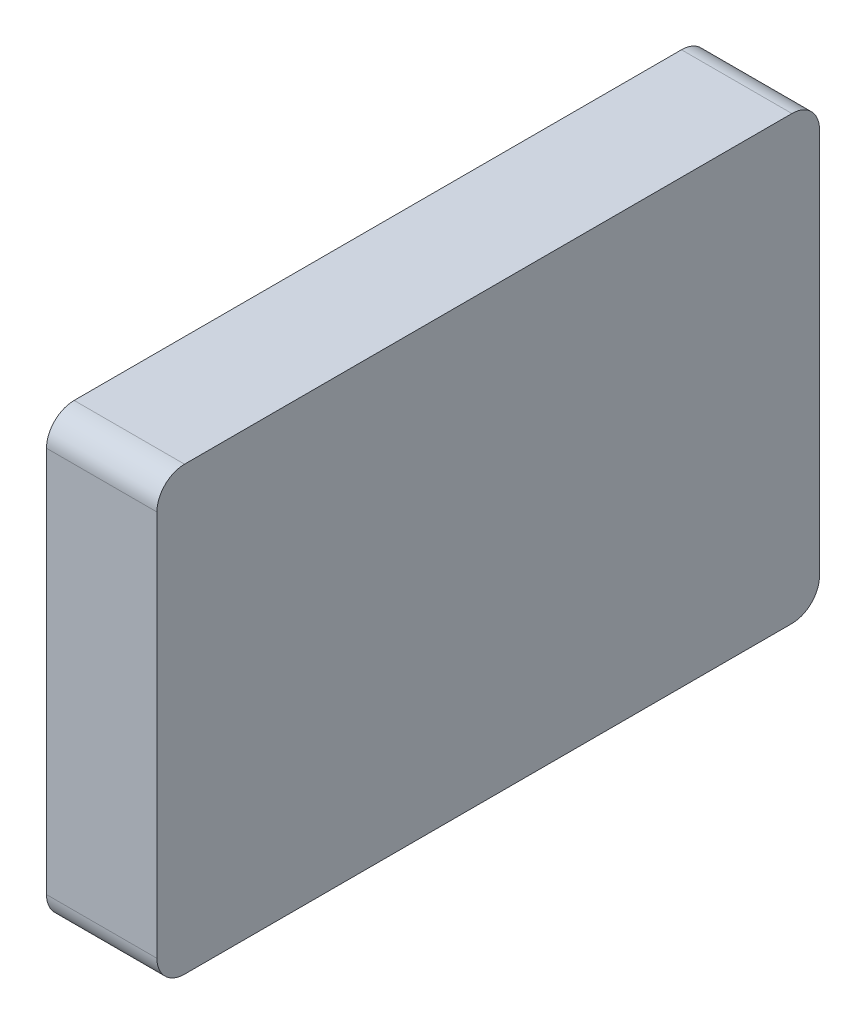
ISO-10303-21;
HEADER;
FILE_DESCRIPTION(('STEP AP214'),'2;1');
FILE_NAME('part.step','',(''),(''),'','','');
FILE_SCHEMA(('AUTOMOTIVE_DESIGN { 1 0 10303 214 1 1 1 1 }'));
ENDSEC;
DATA;
#1=APPLICATION_CONTEXT('core data for automotive mechanical design processes');
#2=APPLICATION_PROTOCOL_DEFINITION('international standard','automotive_design',2000,#1);
#3=PRODUCT_CONTEXT('',#1,'mechanical');
#4=PRODUCT('Part','Part','',(#3));
#5=PRODUCT_RELATED_PRODUCT_CATEGORY('part','',(#4));
#6=PRODUCT_DEFINITION_FORMATION('','',#4);
#7=PRODUCT_DEFINITION_CONTEXT('part definition',#1,'design');
#8=PRODUCT_DEFINITION('design','',#6,#7);
#9=PRODUCT_DEFINITION_SHAPE('','',#8);
#10=(LENGTH_UNIT() NAMED_UNIT(*) SI_UNIT(.MILLI.,.METRE.));
#11=(NAMED_UNIT(*) PLANE_ANGLE_UNIT() SI_UNIT($,.RADIAN.));
#12=(NAMED_UNIT(*) SI_UNIT($,.STERADIAN.) SOLID_ANGLE_UNIT());
#13=UNCERTAINTY_MEASURE_WITH_UNIT(LENGTH_MEASURE(1.E-05),#10,'distance_accuracy_value','');
#14=(GEOMETRIC_REPRESENTATION_CONTEXT(3) GLOBAL_UNCERTAINTY_ASSIGNED_CONTEXT((#13)) GLOBAL_UNIT_ASSIGNED_CONTEXT((#10,
#11,#12)) REPRESENTATION_CONTEXT('',''));
#15=CARTESIAN_POINT('',(0.,0.,0.));
#16=DIRECTION('',(0.,0.,1.));
#17=DIRECTION('',(1.,0.,0.));
#18=AXIS2_PLACEMENT_3D('',#15,#16,#17);
#19=CARTESIAN_POINT('',(-27.1,-1.132,78.713));
#20=DIRECTION('',(1.,0.,0.));
#21=DIRECTION('',(0.,0.,-1.));
#22=AXIS2_PLACEMENT_3D('',#19,#20,#21);
#23=PLANE('',#22);
#24=DIRECTION('',(0.,0.,-1.));
#25=VECTOR('',#24,1.);
#26=CARTESIAN_POINT('',(-27.1,102.5,-0.535000000000001));
#27=LINE('',#26,#25);
#28=CARTESIAN_POINT('',(-27.1,102.5,69.3149999999997));
#29=VERTEX_POINT('',#28);
#30=CARTESIAN_POINT('',(-27.1,102.5,-70.385));
#31=VERTEX_POINT('',#30);
#32=EDGE_CURVE('E107',#29,#31,#27,.T.);
#33=ORIENTED_EDGE('',*,*,#32,.F.);
#34=CARTESIAN_POINT('',(-27.1,96.15,69.315));
#35=DIRECTION('',(-1.,0.,0.));
#36=DIRECTION('',(0.,-1.,0.));
#37=AXIS2_PLACEMENT_3D('',#34,#35,#36);
#38=CIRCLE('',#37,6.34999999999998);
#39=CARTESIAN_POINT('',(-27.1,96.15,75.665));
#40=VERTEX_POINT('',#39);
#41=EDGE_CURVE('E125',#29,#40,#38,.F.);
#42=ORIENTED_EDGE('',*,*,#41,.T.);
#43=DIRECTION('',(0.,1.,0.));
#44=VECTOR('',#43,1.);
#45=CARTESIAN_POINT('',(-27.1,51.7,75.665));
#46=LINE('',#45,#44);
#47=CARTESIAN_POINT('',(-27.1,7.25000000000033,75.665));
#48=VERTEX_POINT('',#47);
#49=EDGE_CURVE('E79',#48,#40,#46,.T.);
#50=ORIENTED_EDGE('',*,*,#49,.F.);
#51=CARTESIAN_POINT('',(-27.1,7.25,69.315));
#52=DIRECTION('',(-1.,0.,0.));
#53=DIRECTION('',(0.,0.,1.));
#54=AXIS2_PLACEMENT_3D('',#51,#52,#53);
#55=CIRCLE('',#54,6.35);
#56=CARTESIAN_POINT('',(-27.1,0.9,69.315));
#57=VERTEX_POINT('',#56);
#58=EDGE_CURVE('E20',#48,#57,#55,.F.);
#59=ORIENTED_EDGE('',*,*,#58,.T.);
#60=DIRECTION('',(0.,0.,1.));
#61=VECTOR('',#60,1.);
#62=CARTESIAN_POINT('',(-27.1,0.9,-0.535000000000001));
#63=LINE('',#62,#61);
#64=CARTESIAN_POINT('',(-27.1,0.900000000000006,-70.3849999999997));
#65=VERTEX_POINT('',#64);
#66=EDGE_CURVE('E84',#65,#57,#63,.T.);
#67=ORIENTED_EDGE('',*,*,#66,.F.);
#68=CARTESIAN_POINT('',(-27.1,7.25,-70.385));
#69=DIRECTION('',(-1.,0.,0.));
#70=DIRECTION('',(0.,-1.,0.));
#71=AXIS2_PLACEMENT_3D('',#68,#69,#70);
#72=CIRCLE('',#71,6.34999999999999);
#73=CARTESIAN_POINT('',(-27.1,7.25,-76.735));
#74=VERTEX_POINT('',#73);
#75=EDGE_CURVE('E102',#65,#74,#72,.F.);
#76=ORIENTED_EDGE('',*,*,#75,.T.);
#77=DIRECTION('',(0.,-1.,0.));
#78=VECTOR('',#77,1.);
#79=CARTESIAN_POINT('',(-27.1,51.7,-76.735));
#80=LINE('',#79,#78);
#81=CARTESIAN_POINT('',(-27.1,96.1499999999997,-76.735));
#82=VERTEX_POINT('',#81);
#83=EDGE_CURVE('E112',#82,#74,#80,.T.);
#84=ORIENTED_EDGE('',*,*,#83,.F.);
#85=CARTESIAN_POINT('',(-27.1,96.15,-70.385));
#86=DIRECTION('',(-1.,0.,0.));
#87=DIRECTION('',(0.,0.,1.));
#88=AXIS2_PLACEMENT_3D('',#85,#86,#87);
#89=CIRCLE('',#88,6.34999999999998);
#90=EDGE_CURVE('E110',#82,#31,#89,.F.);
#91=ORIENTED_EDGE('',*,*,#90,.T.);
#92=EDGE_LOOP('',(#33,#42,#50,#59,#67,#76,#84,#91));
#93=FACE_BOUND('',#92,.T.);
#94=ADVANCED_FACE('F16',(#93),#23,.T.);
#95=CARTESIAN_POINT('',(-53.008,97.928,75.665));
#96=DIRECTION('',(0.,0.,1.));
#97=DIRECTION('',(0.,-1.,0.));
#98=AXIS2_PLACEMENT_3D('',#95,#96,#97);
#99=PLANE('',#98);
#100=ORIENTED_EDGE('',*,*,#49,.T.);
#101=DIRECTION('',(-1.,0.,0.));
#102=VECTOR('',#101,1.);
#103=CARTESIAN_POINT('',(-39.8,96.15,75.665));
#104=LINE('',#103,#102);
#105=CARTESIAN_POINT('',(-52.4999999999996,96.15,75.665));
#106=VERTEX_POINT('',#105);
#107=EDGE_CURVE('E141',#40,#106,#104,.T.);
#108=ORIENTED_EDGE('',*,*,#107,.T.);
#109=DIRECTION('',(0.,-1.,0.));
#110=VECTOR('',#109,1.);
#111=CARTESIAN_POINT('',(-52.5,51.7,75.665));
#112=LINE('',#111,#110);
#113=CARTESIAN_POINT('',(-52.4999999999996,7.25000000000033,75.665));
#114=VERTEX_POINT('',#113);
#115=EDGE_CURVE('E124',#106,#114,#112,.T.);
#116=ORIENTED_EDGE('',*,*,#115,.T.);
#117=DIRECTION('',(1.,0.,0.));
#118=VECTOR('',#117,1.);
#119=CARTESIAN_POINT('',(-39.8,7.25000000000065,75.665));
#120=LINE('',#119,#118);
#121=EDGE_CURVE('E96',#114,#48,#120,.T.);
#122=ORIENTED_EDGE('',*,*,#121,.T.);
#123=EDGE_LOOP('',(#100,#108,#116,#122));
#124=FACE_BOUND('',#123,.T.);
#125=ADVANCED_FACE('F160',(#124),#99,.T.);
#126=CARTESIAN_POINT('',(-27.1,7.25,69.315));
#127=DIRECTION('',(-1.,0.,0.));
#128=DIRECTION('',(0.,0.,1.));
#129=AXIS2_PLACEMENT_3D('',#126,#127,#128);
#130=CYLINDRICAL_SURFACE('',#129,6.35);
#131=ORIENTED_EDGE('',*,*,#121,.F.);
#132=CARTESIAN_POINT('',(-52.4999999999992,7.25,69.315));
#133=DIRECTION('',(-1.,0.,0.));
#134=DIRECTION('',(0.,0.,1.));
#135=AXIS2_PLACEMENT_3D('',#132,#133,#134);
#136=CIRCLE('',#135,6.35);
#137=CARTESIAN_POINT('',(-52.4999999999996,0.899999999999997,69.315));
#138=VERTEX_POINT('',#137);
#139=EDGE_CURVE('E100',#114,#138,#136,.F.);
#140=ORIENTED_EDGE('',*,*,#139,.T.);
#141=DIRECTION('',(-1.,0.,0.));
#142=VECTOR('',#141,1.);
#143=CARTESIAN_POINT('',(-39.8,0.9,69.315));
#144=LINE('',#143,#142);
#145=EDGE_CURVE('E88',#57,#138,#144,.T.);
#146=ORIENTED_EDGE('',*,*,#145,.F.);
#147=ORIENTED_EDGE('',*,*,#58,.F.);
#148=EDGE_LOOP('',(#131,#140,#146,#147));
#149=FACE_BOUND('',#148,.T.);
#150=ADVANCED_FACE('F98',(#149),#130,.T.);
#151=CARTESIAN_POINT('',(-53.008,0.9,72.109));
#152=DIRECTION('',(0.,-1.,0.));
#153=DIRECTION('',(0.,0.,-1.));
#154=AXIS2_PLACEMENT_3D('',#151,#152,#153);
#155=PLANE('',#154);
#156=ORIENTED_EDGE('',*,*,#66,.T.);
#157=ORIENTED_EDGE('',*,*,#145,.T.);
#158=DIRECTION('',(0.,0.,-1.));
#159=VECTOR('',#158,1.);
#160=CARTESIAN_POINT('',(-52.5,0.899999999999996,-0.535000000000001));
#161=LINE('',#160,#159);
#162=CARTESIAN_POINT('',(-52.4999999999996,0.9,-70.3849999999997));
#163=VERTEX_POINT('',#162);
#164=EDGE_CURVE('E122',#138,#163,#161,.T.);
#165=ORIENTED_EDGE('',*,*,#164,.T.);
#166=DIRECTION('',(1.,0.,0.));
#167=VECTOR('',#166,1.);
#168=CARTESIAN_POINT('',(-39.8,0.900000000000012,-70.3849999999994));
#169=LINE('',#168,#167);
#170=EDGE_CURVE('E90',#163,#65,#169,.T.);
#171=ORIENTED_EDGE('',*,*,#170,.T.);
#172=EDGE_LOOP('',(#156,#157,#165,#171));
#173=FACE_BOUND('',#172,.T.);
#174=ADVANCED_FACE('F85',(#173),#155,.T.);
#175=CARTESIAN_POINT('',(-27.1,7.25,-70.385));
#176=DIRECTION('',(-1.,0.,0.));
#177=DIRECTION('',(0.,-1.,0.));
#178=AXIS2_PLACEMENT_3D('',#175,#176,#177);
#179=CYLINDRICAL_SURFACE('',#178,6.34999999999999);
#180=ORIENTED_EDGE('',*,*,#170,.F.);
#181=CARTESIAN_POINT('',(-52.4999999999992,7.24999999999999,-70.385));
#182=DIRECTION('',(-1.,0.,0.));
#183=DIRECTION('',(0.,-1.,0.));
#184=AXIS2_PLACEMENT_3D('',#181,#182,#183);
#185=CIRCLE('',#184,6.34999999999999);
#186=CARTESIAN_POINT('',(-52.4999999999996,7.25,-76.735));
#187=VERTEX_POINT('',#186);
#188=EDGE_CURVE('E119',#163,#187,#185,.F.);
#189=ORIENTED_EDGE('',*,*,#188,.T.);
#190=DIRECTION('',(-1.,0.,0.));
#191=VECTOR('',#190,1.);
#192=CARTESIAN_POINT('',(-39.8,7.25,-76.735));
#193=LINE('',#192,#191);
#194=EDGE_CURVE('E113',#74,#187,#193,.T.);
#195=ORIENTED_EDGE('',*,*,#194,.F.);
#196=ORIENTED_EDGE('',*,*,#75,.F.);
#197=EDGE_LOOP('',(#180,#189,#195,#196));
#198=FACE_BOUND('',#197,.T.);
#199=ADVANCED_FACE('F132',(#198),#179,.T.);
#200=CARTESIAN_POINT('',(-53.008,5.472,-76.735));
#201=DIRECTION('',(0.,0.,-1.));
#202=DIRECTION('',(0.,1.,0.));
#203=AXIS2_PLACEMENT_3D('',#200,#201,#202);
#204=PLANE('',#203);
#205=ORIENTED_EDGE('',*,*,#83,.T.);
#206=ORIENTED_EDGE('',*,*,#194,.T.);
#207=DIRECTION('',(0.,1.,0.));
#208=VECTOR('',#207,1.);
#209=CARTESIAN_POINT('',(-52.5,51.7,-76.735));
#210=LINE('',#209,#208);
#211=CARTESIAN_POINT('',(-52.4999999999996,96.1499999999997,-76.735));
#212=VERTEX_POINT('',#211);
#213=EDGE_CURVE('E118',#187,#212,#210,.T.);
#214=ORIENTED_EDGE('',*,*,#213,.T.);
#215=DIRECTION('',(1.,0.,0.));
#216=VECTOR('',#215,1.);
#217=CARTESIAN_POINT('',(-39.8,96.1499999999994,-76.735));
#218=LINE('',#217,#216);
#219=EDGE_CURVE('E128',#212,#82,#218,.T.);
#220=ORIENTED_EDGE('',*,*,#219,.T.);
#221=EDGE_LOOP('',(#205,#206,#214,#220));
#222=FACE_BOUND('',#221,.T.);
#223=ADVANCED_FACE('F158',(#222),#204,.T.);
#224=CARTESIAN_POINT('',(-27.1,96.15,-70.385));
#225=DIRECTION('',(-1.,0.,0.));
#226=DIRECTION('',(0.,0.,1.));
#227=AXIS2_PLACEMENT_3D('',#224,#225,#226);
#228=CYLINDRICAL_SURFACE('',#227,6.34999999999998);
#229=ORIENTED_EDGE('',*,*,#219,.F.);
#230=CARTESIAN_POINT('',(-52.4999999999992,96.15,-70.385));
#231=DIRECTION('',(-1.,0.,0.));
#232=DIRECTION('',(0.,0.,1.));
#233=AXIS2_PLACEMENT_3D('',#230,#231,#232);
#234=CIRCLE('',#233,6.34999999999998);
#235=CARTESIAN_POINT('',(-52.4999999999996,102.5,-70.385));
#236=VERTEX_POINT('',#235);
#237=EDGE_CURVE('E115',#212,#236,#234,.F.);
#238=ORIENTED_EDGE('',*,*,#237,.T.);
#239=DIRECTION('',(-1.,0.,0.));
#240=VECTOR('',#239,1.);
#241=CARTESIAN_POINT('',(-39.8,102.5,-70.385));
#242=LINE('',#241,#240);
#243=EDGE_CURVE('E109',#31,#236,#242,.T.);
#244=ORIENTED_EDGE('',*,*,#243,.F.);
#245=ORIENTED_EDGE('',*,*,#90,.F.);
#246=EDGE_LOOP('',(#229,#238,#244,#245));
#247=FACE_BOUND('',#246,.T.);
#248=ADVANCED_FACE('F157',(#247),#228,.T.);
#249=CARTESIAN_POINT('',(-53.008,102.5,-73.179));
#250=DIRECTION('',(0.,1.,0.));
#251=DIRECTION('',(0.,0.,1.));
#252=AXIS2_PLACEMENT_3D('',#249,#250,#251);
#253=PLANE('',#252);
#254=ORIENTED_EDGE('',*,*,#32,.T.);
#255=ORIENTED_EDGE('',*,*,#243,.T.);
#256=DIRECTION('',(0.,0.,1.));
#257=VECTOR('',#256,1.);
#258=CARTESIAN_POINT('',(-52.5,102.5,-0.535000000000008));
#259=LINE('',#258,#257);
#260=CARTESIAN_POINT('',(-52.4999999999996,102.5,69.3149999999997));
#261=VERTEX_POINT('',#260);
#262=EDGE_CURVE('E26',#236,#261,#259,.T.);
#263=ORIENTED_EDGE('',*,*,#262,.T.);
#264=DIRECTION('',(1.,0.,0.));
#265=VECTOR('',#264,1.);
#266=CARTESIAN_POINT('',(-39.8,102.5,69.3149999999993));
#267=LINE('',#266,#265);
#268=EDGE_CURVE('E34',#261,#29,#267,.T.);
#269=ORIENTED_EDGE('',*,*,#268,.T.);
#270=EDGE_LOOP('',(#254,#255,#263,#269));
#271=FACE_BOUND('',#270,.T.);
#272=ADVANCED_FACE('F152',(#271),#253,.T.);
#273=CARTESIAN_POINT('',(-27.1,96.15,69.315));
#274=DIRECTION('',(-1.,0.,0.));
#275=DIRECTION('',(0.,-1.,0.));
#276=AXIS2_PLACEMENT_3D('',#273,#274,#275);
#277=CYLINDRICAL_SURFACE('',#276,6.34999999999998);
#278=ORIENTED_EDGE('',*,*,#268,.F.);
#279=CARTESIAN_POINT('',(-52.4999999999992,96.15,69.315));
#280=DIRECTION('',(-1.,0.,0.));
#281=DIRECTION('',(0.,-1.,0.));
#282=AXIS2_PLACEMENT_3D('',#279,#280,#281);
#283=CIRCLE('',#282,6.34999999999998);
#284=EDGE_CURVE('E11',#261,#106,#283,.F.);
#285=ORIENTED_EDGE('',*,*,#284,.T.);
#286=ORIENTED_EDGE('',*,*,#107,.F.);
#287=ORIENTED_EDGE('',*,*,#41,.F.);
#288=EDGE_LOOP('',(#278,#285,#286,#287));
#289=FACE_BOUND('',#288,.T.);
#290=ADVANCED_FACE('F162',(#289),#277,.T.);
#291=CARTESIAN_POINT('',(-52.5,-1.132,78.713));
#292=DIRECTION('',(1.,0.,0.));
#293=DIRECTION('',(0.,0.,-1.));
#294=AXIS2_PLACEMENT_3D('',#291,#292,#293);
#295=PLANE('',#294);
#296=ORIENTED_EDGE('',*,*,#262,.F.);
#297=ORIENTED_EDGE('',*,*,#237,.F.);
#298=ORIENTED_EDGE('',*,*,#213,.F.);
#299=ORIENTED_EDGE('',*,*,#188,.F.);
#300=ORIENTED_EDGE('',*,*,#164,.F.);
#301=ORIENTED_EDGE('',*,*,#139,.F.);
#302=ORIENTED_EDGE('',*,*,#115,.F.);
#303=ORIENTED_EDGE('',*,*,#284,.F.);
#304=EDGE_LOOP('',(#296,#297,#298,#299,#300,#301,#302,#303));
#305=FACE_BOUND('',#304,.T.);
#306=ADVANCED_FACE('F18',(#305),#295,.F.);
#307=CLOSED_SHELL('',(#94,#125,#150,#174,#199,#223,#248,#272,#290,#306));
#308=MANIFOLD_SOLID_BREP('B1',#307);
#309=ADVANCED_BREP_SHAPE_REPRESENTATION('',(#18,#308),#14);
#310=SHAPE_DEFINITION_REPRESENTATION(#9,#309);
ENDSEC;
END-ISO-10303-21;
